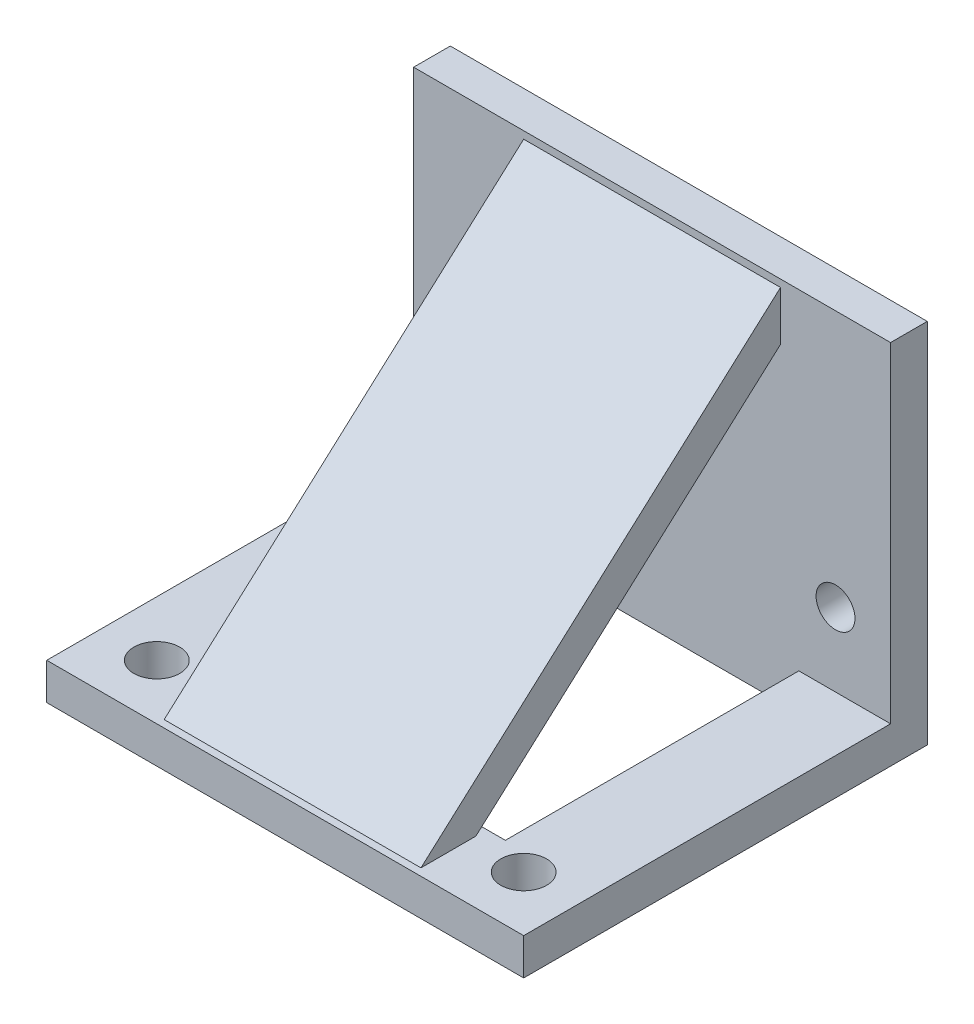
ISO-10303-21;
HEADER;
FILE_DESCRIPTION(('STEP AP214'),'2;1');
FILE_NAME('part.step','',(''),(''),'','','');
FILE_SCHEMA(('AUTOMOTIVE_DESIGN { 1 0 10303 214 1 1 1 1 }'));
ENDSEC;
DATA;
#1=APPLICATION_CONTEXT('core data for automotive mechanical design processes');
#2=APPLICATION_PROTOCOL_DEFINITION('international standard','automotive_design',2000,#1);
#3=PRODUCT_CONTEXT('',#1,'mechanical');
#4=PRODUCT('Part','Part','',(#3));
#5=PRODUCT_RELATED_PRODUCT_CATEGORY('part','',(#4));
#6=PRODUCT_DEFINITION_FORMATION('','',#4);
#7=PRODUCT_DEFINITION_CONTEXT('part definition',#1,'design');
#8=PRODUCT_DEFINITION('design','',#6,#7);
#9=PRODUCT_DEFINITION_SHAPE('','',#8);
#10=(LENGTH_UNIT() NAMED_UNIT(*) SI_UNIT(.MILLI.,.METRE.));
#11=(NAMED_UNIT(*) PLANE_ANGLE_UNIT() SI_UNIT($,.RADIAN.));
#12=(NAMED_UNIT(*) SI_UNIT($,.STERADIAN.) SOLID_ANGLE_UNIT());
#13=UNCERTAINTY_MEASURE_WITH_UNIT(LENGTH_MEASURE(1.E-05),#10,'distance_accuracy_value','');
#14=(GEOMETRIC_REPRESENTATION_CONTEXT(3) GLOBAL_UNCERTAINTY_ASSIGNED_CONTEXT((#13)) GLOBAL_UNIT_ASSIGNED_CONTEXT((#10,
#11,#12)) REPRESENTATION_CONTEXT('',''));
#15=CARTESIAN_POINT('',(0.,0.,0.));
#16=DIRECTION('',(0.,0.,1.));
#17=DIRECTION('',(1.,0.,0.));
#18=AXIS2_PLACEMENT_3D('',#15,#16,#17);
#19=CARTESIAN_POINT('',(0.,0.,5.));
#20=DIRECTION('',(0.,1.,0.));
#21=DIRECTION('',(-1.,0.,0.));
#22=AXIS2_PLACEMENT_3D('',#19,#20,#21);
#23=PLANE('',#22);
#24=DIRECTION('',(0.,0.,-1.));
#25=VECTOR('',#24,1.);
#26=CARTESIAN_POINT('',(-20.,0.,45.));
#27=LINE('',#26,#25);
#28=CARTESIAN_POINT('',(-20.,0.,45.));
#29=VERTEX_POINT('',#28);
#30=CARTESIAN_POINT('',(-20.,0.,5.));
#31=VERTEX_POINT('',#30);
#32=EDGE_CURVE('E149',#29,#31,#27,.T.);
#33=ORIENTED_EDGE('',*,*,#32,.F.);
#34=DIRECTION('',(-1.,0.,0.));
#35=VECTOR('',#34,1.);
#36=CARTESIAN_POINT('',(-20.,0.,45.));
#37=LINE('',#36,#35);
#38=CARTESIAN_POINT('',(20.,0.,45.));
#39=VERTEX_POINT('',#38);
#40=EDGE_CURVE('E363',#39,#29,#37,.T.);
#41=ORIENTED_EDGE('',*,*,#40,.F.);
#42=DIRECTION('',(0.,0.,1.));
#43=VECTOR('',#42,1.);
#44=CARTESIAN_POINT('',(20.,0.,45.));
#45=LINE('',#44,#43);
#46=CARTESIAN_POINT('',(20.,0.,5.));
#47=VERTEX_POINT('',#46);
#48=EDGE_CURVE('E161',#47,#39,#45,.T.);
#49=ORIENTED_EDGE('',*,*,#48,.F.);
#50=DIRECTION('',(1.,0.,0.));
#51=VECTOR('',#50,1.);
#52=CARTESIAN_POINT('',(-20.,0.,5.));
#53=LINE('',#52,#51);
#54=EDGE_CURVE('E57',#31,#47,#53,.T.);
#55=ORIENTED_EDGE('',*,*,#54,.F.);
#56=EDGE_LOOP('',(#33,#41,#49,#55));
#57=FACE_BOUND('',#56,.T.);
#58=CARTESIAN_POINT('',(-25.,0.,47.5));
#59=DIRECTION('',(0.,1.,0.));
#60=DIRECTION('',(-1.,0.,0.));
#61=AXIS2_PLACEMENT_3D('',#58,#59,#60);
#62=CIRCLE('',#61,3.125);
#63=CARTESIAN_POINT('',(-28.125,0.,47.5));
#64=VERTEX_POINT('',#63);
#65=EDGE_CURVE('E177',#64,#64,#62,.T.);
#66=ORIENTED_EDGE('',*,*,#65,.T.);
#67=EDGE_LOOP('',(#66));
#68=FACE_BOUND('',#67,.T.);
#69=CARTESIAN_POINT('',(25.,0.,47.5));
#70=DIRECTION('',(0.,1.,0.));
#71=DIRECTION('',(1.,0.,0.));
#72=AXIS2_PLACEMENT_3D('',#69,#70,#71);
#73=CIRCLE('',#72,3.125);
#74=CARTESIAN_POINT('',(28.125,0.,47.5));
#75=VERTEX_POINT('',#74);
#76=EDGE_CURVE('E181',#75,#75,#73,.T.);
#77=ORIENTED_EDGE('',*,*,#76,.T.);
#78=EDGE_LOOP('',(#77));
#79=FACE_BOUND('',#78,.T.);
#80=DIRECTION('',(1.,0.,0.));
#81=VECTOR('',#80,1.);
#82=CARTESIAN_POINT('',(0.,0.,0.));
#83=LINE('',#82,#81);
#84=CARTESIAN_POINT('',(-32.5,0.,0.));
#85=VERTEX_POINT('',#84);
#86=CARTESIAN_POINT('',(32.5,0.,0.));
#87=VERTEX_POINT('',#86);
#88=EDGE_CURVE('E226',#85,#87,#83,.T.);
#89=ORIENTED_EDGE('',*,*,#88,.T.);
#90=DIRECTION('',(0.,0.,-1.));
#91=VECTOR('',#90,1.);
#92=CARTESIAN_POINT('',(32.5,0.,5.));
#93=LINE('',#92,#91);
#94=CARTESIAN_POINT('',(32.5,0.,55.));
#95=VERTEX_POINT('',#94);
#96=EDGE_CURVE('E50',#95,#87,#93,.T.);
#97=ORIENTED_EDGE('',*,*,#96,.F.);
#98=DIRECTION('',(1.,0.,0.));
#99=VECTOR('',#98,1.);
#100=CARTESIAN_POINT('',(-32.5,0.,55.));
#101=LINE('',#100,#99);
#102=CARTESIAN_POINT('',(-32.5,0.,55.));
#103=VERTEX_POINT('',#102);
#104=EDGE_CURVE('E220',#103,#95,#101,.T.);
#105=ORIENTED_EDGE('',*,*,#104,.F.);
#106=DIRECTION('',(0.,0.,-1.));
#107=VECTOR('',#106,1.);
#108=CARTESIAN_POINT('',(-32.5,0.,5.));
#109=LINE('',#108,#107);
#110=EDGE_CURVE('E238',#103,#85,#109,.T.);
#111=ORIENTED_EDGE('',*,*,#110,.T.);
#112=EDGE_LOOP('',(#89,#97,#105,#111));
#113=FACE_BOUND('',#112,.T.);
#114=ADVANCED_FACE('F43',(#57,#68,#79,#113),#23,.F.);
#115=CARTESIAN_POINT('',(32.5,0.,5.));
#116=DIRECTION('',(-1.,0.,0.));
#117=DIRECTION('',(0.,0.,1.));
#118=AXIS2_PLACEMENT_3D('',#115,#116,#117);
#119=PLANE('',#118);
#120=DIRECTION('',(0.,-1.,0.));
#121=VECTOR('',#120,1.);
#122=CARTESIAN_POINT('',(32.5,50.,5.));
#123=LINE('',#122,#121);
#124=CARTESIAN_POINT('',(32.5,50.,5.));
#125=VERTEX_POINT('',#124);
#126=CARTESIAN_POINT('',(32.5,5.00000000000004,5.));
#127=VERTEX_POINT('',#126);
#128=EDGE_CURVE('E199',#125,#127,#123,.T.);
#129=ORIENTED_EDGE('',*,*,#128,.T.);
#130=DIRECTION('',(0.,0.,1.));
#131=VECTOR('',#130,1.);
#132=CARTESIAN_POINT('',(32.5,5.00000000000004,54.));
#133=LINE('',#132,#131);
#134=CARTESIAN_POINT('',(32.5,5.00000000000004,55.));
#135=VERTEX_POINT('',#134);
#136=EDGE_CURVE('E202',#127,#135,#133,.T.);
#137=ORIENTED_EDGE('',*,*,#136,.T.);
#138=DIRECTION('',(0.,1.,0.));
#139=VECTOR('',#138,1.);
#140=CARTESIAN_POINT('',(32.5,50.,55.));
#141=LINE('',#140,#139);
#142=EDGE_CURVE('E223',#95,#135,#141,.T.);
#143=ORIENTED_EDGE('',*,*,#142,.F.);
#144=ORIENTED_EDGE('',*,*,#96,.T.);
#145=DIRECTION('',(0.,1.,0.));
#146=VECTOR('',#145,1.);
#147=CARTESIAN_POINT('',(32.5,0.,0.));
#148=LINE('',#147,#146);
#149=CARTESIAN_POINT('',(32.5,50.,0.));
#150=VERTEX_POINT('',#149);
#151=EDGE_CURVE('E229',#87,#150,#148,.T.);
#152=ORIENTED_EDGE('',*,*,#151,.T.);
#153=DIRECTION('',(0.,0.,-1.));
#154=VECTOR('',#153,1.);
#155=CARTESIAN_POINT('',(32.5,50.,5.));
#156=LINE('',#155,#154);
#157=EDGE_CURVE('E242',#125,#150,#156,.T.);
#158=ORIENTED_EDGE('',*,*,#157,.F.);
#159=EDGE_LOOP('',(#129,#137,#143,#144,#152,#158));
#160=FACE_BOUND('',#159,.T.);
#161=ADVANCED_FACE('F246',(#160),#119,.F.);
#162=CARTESIAN_POINT('',(0.,50.,5.));
#163=DIRECTION('',(0.,1.,0.));
#164=DIRECTION('',(-1.,0.,0.));
#165=AXIS2_PLACEMENT_3D('',#162,#163,#164);
#166=PLANE('',#165);
#167=DIRECTION('',(-1.,0.,0.));
#168=VECTOR('',#167,1.);
#169=CARTESIAN_POINT('',(32.5,50.,5.));
#170=LINE('',#169,#168);
#171=CARTESIAN_POINT('',(-32.5,50.,5.));
#172=VERTEX_POINT('',#171);
#173=EDGE_CURVE('E205',#125,#172,#170,.T.);
#174=ORIENTED_EDGE('',*,*,#173,.F.);
#175=ORIENTED_EDGE('',*,*,#157,.T.);
#176=DIRECTION('',(1.,0.,0.));
#177=VECTOR('',#176,1.);
#178=CARTESIAN_POINT('',(0.,50.,0.));
#179=LINE('',#178,#177);
#180=CARTESIAN_POINT('',(-32.5,50.,0.));
#181=VERTEX_POINT('',#180);
#182=EDGE_CURVE('E232',#181,#150,#179,.T.);
#183=ORIENTED_EDGE('',*,*,#182,.F.);
#184=DIRECTION('',(0.,0.,-1.));
#185=VECTOR('',#184,1.);
#186=CARTESIAN_POINT('',(-32.5,50.,5.));
#187=LINE('',#186,#185);
#188=EDGE_CURVE('E240',#172,#181,#187,.T.);
#189=ORIENTED_EDGE('',*,*,#188,.F.);
#190=EDGE_LOOP('',(#174,#175,#183,#189));
#191=FACE_BOUND('',#190,.T.);
#192=ADVANCED_FACE('F262',(#191),#166,.T.);
#193=CARTESIAN_POINT('',(-32.5,0.,5.));
#194=DIRECTION('',(-1.,0.,0.));
#195=DIRECTION('',(0.,-1.,0.));
#196=AXIS2_PLACEMENT_3D('',#193,#194,#195);
#197=PLANE('',#196);
#198=DIRECTION('',(0.,0.,1.));
#199=VECTOR('',#198,1.);
#200=CARTESIAN_POINT('',(-32.5,5.,54.));
#201=LINE('',#200,#199);
#202=CARTESIAN_POINT('',(-32.5,5.00000000000004,5.));
#203=VERTEX_POINT('',#202);
#204=CARTESIAN_POINT('',(-32.5,5.,55.));
#205=VERTEX_POINT('',#204);
#206=EDGE_CURVE('E203',#203,#205,#201,.T.);
#207=ORIENTED_EDGE('',*,*,#206,.F.);
#208=DIRECTION('',(0.,-1.,0.));
#209=VECTOR('',#208,1.);
#210=CARTESIAN_POINT('',(-32.5,50.,5.));
#211=LINE('',#210,#209);
#212=EDGE_CURVE('E166',#172,#203,#211,.T.);
#213=ORIENTED_EDGE('',*,*,#212,.F.);
#214=ORIENTED_EDGE('',*,*,#188,.T.);
#215=DIRECTION('',(0.,1.,0.));
#216=VECTOR('',#215,1.);
#217=CARTESIAN_POINT('',(-32.5,0.,0.));
#218=LINE('',#217,#216);
#219=EDGE_CURVE('E235',#85,#181,#218,.T.);
#220=ORIENTED_EDGE('',*,*,#219,.F.);
#221=ORIENTED_EDGE('',*,*,#110,.F.);
#222=DIRECTION('',(0.,-1.,0.));
#223=VECTOR('',#222,1.);
#224=CARTESIAN_POINT('',(-32.5,50.,55.));
#225=LINE('',#224,#223);
#226=EDGE_CURVE('E211',#205,#103,#225,.T.);
#227=ORIENTED_EDGE('',*,*,#226,.F.);
#228=EDGE_LOOP('',(#207,#213,#214,#220,#221,#227));
#229=FACE_BOUND('',#228,.T.);
#230=ADVANCED_FACE('F256',(#229),#197,.T.);
#231=CARTESIAN_POINT('',(0.,0.,0.));
#232=DIRECTION('',(0.,0.,1.));
#233=DIRECTION('',(1.,0.,0.));
#234=AXIS2_PLACEMENT_3D('',#231,#232,#233);
#235=PLANE('',#234);
#236=CARTESIAN_POINT('',(-25.,15.,0.));
#237=DIRECTION('',(0.,0.,1.));
#238=DIRECTION('',(1.,0.,0.));
#239=AXIS2_PLACEMENT_3D('',#236,#237,#238);
#240=CIRCLE('',#239,2.65);
#241=CARTESIAN_POINT('',(-22.35,15.,0.));
#242=VERTEX_POINT('',#241);
#243=EDGE_CURVE('E189',#242,#242,#240,.T.);
#244=ORIENTED_EDGE('',*,*,#243,.T.);
#245=EDGE_LOOP('',(#244));
#246=FACE_BOUND('',#245,.T.);
#247=CARTESIAN_POINT('',(25.,15.,0.));
#248=DIRECTION('',(0.,0.,1.));
#249=DIRECTION('',(-1.,0.,0.));
#250=AXIS2_PLACEMENT_3D('',#247,#248,#249);
#251=CIRCLE('',#250,2.65);
#252=CARTESIAN_POINT('',(22.35,15.,0.));
#253=VERTEX_POINT('',#252);
#254=EDGE_CURVE('E180',#253,#253,#251,.T.);
#255=ORIENTED_EDGE('',*,*,#254,.T.);
#256=EDGE_LOOP('',(#255));
#257=FACE_BOUND('',#256,.T.);
#258=ORIENTED_EDGE('',*,*,#88,.F.);
#259=ORIENTED_EDGE('',*,*,#219,.T.);
#260=ORIENTED_EDGE('',*,*,#182,.T.);
#261=ORIENTED_EDGE('',*,*,#151,.F.);
#262=EDGE_LOOP('',(#258,#259,#260,#261));
#263=FACE_BOUND('',#262,.T.);
#264=ADVANCED_FACE('F254',(#246,#257,#263),#235,.F.);
#265=CARTESIAN_POINT('',(0.,0.,55.));
#266=DIRECTION('',(0.,0.,1.));
#267=DIRECTION('',(1.,0.,0.));
#268=AXIS2_PLACEMENT_3D('',#265,#266,#267);
#269=PLANE('',#268);
#270=DIRECTION('',(-1.,0.,0.));
#271=VECTOR('',#270,1.);
#272=CARTESIAN_POINT('',(32.5,5.00000000000004,55.));
#273=LINE('',#272,#271);
#274=EDGE_CURVE('E208',#135,#205,#273,.T.);
#275=ORIENTED_EDGE('',*,*,#274,.T.);
#276=ORIENTED_EDGE('',*,*,#226,.T.);
#277=ORIENTED_EDGE('',*,*,#104,.T.);
#278=ORIENTED_EDGE('',*,*,#142,.T.);
#279=EDGE_LOOP('',(#275,#276,#277,#278));
#280=FACE_BOUND('',#279,.T.);
#281=ADVANCED_FACE('F267',(#280),#269,.T.);
#282=CARTESIAN_POINT('',(32.5,5.00000000000004,54.));
#283=DIRECTION('',(0.,-1.,0.));
#284=DIRECTION('',(1.,0.,0.));
#285=AXIS2_PLACEMENT_3D('',#282,#283,#284);
#286=PLANE('',#285);
#287=CARTESIAN_POINT('',(25.,5.00000000000003,47.5));
#288=DIRECTION('',(0.,1.,0.));
#289=DIRECTION('',(1.,0.,0.));
#290=AXIS2_PLACEMENT_3D('',#287,#288,#289);
#291=CIRCLE('',#290,3.125);
#292=CARTESIAN_POINT('',(28.125,5.00000000000003,47.5));
#293=VERTEX_POINT('',#292);
#294=EDGE_CURVE('E167',#293,#293,#291,.T.);
#295=ORIENTED_EDGE('',*,*,#294,.F.);
#296=EDGE_LOOP('',(#295));
#297=FACE_BOUND('',#296,.T.);
#298=DIRECTION('',(1.,0.,0.));
#299=VECTOR('',#298,1.);
#300=CARTESIAN_POINT('',(-32.5,5.00000000000004,46.5163746245332));
#301=LINE('',#300,#299);
#302=CARTESIAN_POINT('',(-17.5,5.00000000000004,46.5163746245332));
#303=VERTEX_POINT('',#302);
#304=CARTESIAN_POINT('',(17.5,5.00000000000004,46.5163746245332));
#305=VERTEX_POINT('',#304);
#306=EDGE_CURVE('E305',#303,#305,#301,.T.);
#307=ORIENTED_EDGE('',*,*,#306,.T.);
#308=DIRECTION('',(0.,0.,-1.));
#309=VECTOR('',#308,1.);
#310=CARTESIAN_POINT('',(17.5,5.00000000000004,54.));
#311=LINE('',#310,#309);
#312=CARTESIAN_POINT('',(17.5,5.00000000000004,54.));
#313=VERTEX_POINT('',#312);
#314=EDGE_CURVE('E173',#313,#305,#311,.T.);
#315=ORIENTED_EDGE('',*,*,#314,.F.);
#316=DIRECTION('',(-1.,0.,0.));
#317=VECTOR('',#316,1.);
#318=CARTESIAN_POINT('',(32.5,5.00000000000004,54.));
#319=LINE('',#318,#317);
#320=CARTESIAN_POINT('',(-17.5,5.00000000000004,54.));
#321=VERTEX_POINT('',#320);
#322=EDGE_CURVE('E212',#313,#321,#319,.T.);
#323=ORIENTED_EDGE('',*,*,#322,.T.);
#324=DIRECTION('',(0.,0.,1.));
#325=VECTOR('',#324,1.);
#326=CARTESIAN_POINT('',(-17.5,5.00000000000004,5.));
#327=LINE('',#326,#325);
#328=EDGE_CURVE('E349',#303,#321,#327,.T.);
#329=ORIENTED_EDGE('',*,*,#328,.F.);
#330=EDGE_LOOP('',(#307,#315,#323,#329));
#331=FACE_BOUND('',#330,.T.);
#332=CARTESIAN_POINT('',(-25.,5.,47.5));
#333=DIRECTION('',(0.,1.,0.));
#334=DIRECTION('',(-1.,0.,0.));
#335=AXIS2_PLACEMENT_3D('',#332,#333,#334);
#336=CIRCLE('',#335,3.125);
#337=CARTESIAN_POINT('',(-28.125,5.,47.5));
#338=VERTEX_POINT('',#337);
#339=EDGE_CURVE('E182',#338,#338,#336,.T.);
#340=ORIENTED_EDGE('',*,*,#339,.F.);
#341=EDGE_LOOP('',(#340));
#342=FACE_BOUND('',#341,.T.);
#343=DIRECTION('',(1.,0.,0.));
#344=VECTOR('',#343,1.);
#345=CARTESIAN_POINT('',(-20.,5.00000000000001,45.));
#346=LINE('',#345,#344);
#347=CARTESIAN_POINT('',(-20.,5.00000000000002,45.));
#348=VERTEX_POINT('',#347);
#349=CARTESIAN_POINT('',(20.,5.00000000000003,45.));
#350=VERTEX_POINT('',#349);
#351=EDGE_CURVE('E160',#348,#350,#346,.T.);
#352=ORIENTED_EDGE('',*,*,#351,.F.);
#353=DIRECTION('',(0.,0.,1.));
#354=VECTOR('',#353,1.);
#355=CARTESIAN_POINT('',(-20.,5.00000000000001,45.));
#356=LINE('',#355,#354);
#357=CARTESIAN_POINT('',(-20.,5.00000000000004,5.));
#358=VERTEX_POINT('',#357);
#359=EDGE_CURVE('E146',#358,#348,#356,.T.);
#360=ORIENTED_EDGE('',*,*,#359,.F.);
#361=DIRECTION('',(1.,0.,0.));
#362=VECTOR('',#361,1.);
#363=CARTESIAN_POINT('',(17.5,5.00000000000004,5.));
#364=LINE('',#363,#362);
#365=EDGE_CURVE('E157',#203,#358,#364,.T.);
#366=ORIENTED_EDGE('',*,*,#365,.F.);
#367=ORIENTED_EDGE('',*,*,#206,.T.);
#368=ORIENTED_EDGE('',*,*,#274,.F.);
#369=ORIENTED_EDGE('',*,*,#136,.F.);
#370=CARTESIAN_POINT('',(20.,5.00000000000004,5.));
#371=VERTEX_POINT('',#370);
#372=EDGE_CURVE('E168',#371,#127,#364,.T.);
#373=ORIENTED_EDGE('',*,*,#372,.F.);
#374=DIRECTION('',(0.,0.,-1.));
#375=VECTOR('',#374,1.);
#376=CARTESIAN_POINT('',(20.,5.00000000000003,45.));
#377=LINE('',#376,#375);
#378=EDGE_CURVE('E64',#350,#371,#377,.T.);
#379=ORIENTED_EDGE('',*,*,#378,.F.);
#380=EDGE_LOOP('',(#352,#360,#366,#367,#368,#369,#373,#379));
#381=FACE_BOUND('',#380,.T.);
#382=ADVANCED_FACE('F156',(#297,#331,#342,#381),#286,.F.);
#383=CARTESIAN_POINT('',(32.5,49.,5.));
#384=DIRECTION('',(0.,-0.744048711529002,-0.66812537361788));
#385=DIRECTION('',(0.,0.66812537361788,-0.744048711529002));
#386=AXIS2_PLACEMENT_3D('',#383,#384,#385);
#387=PLANE('',#386);
#388=DIRECTION('',(-1.,0.,0.));
#389=VECTOR('',#388,1.);
#390=CARTESIAN_POINT('',(32.5,49.,5.));
#391=LINE('',#390,#389);
#392=CARTESIAN_POINT('',(17.5,49.,5.));
#393=VERTEX_POINT('',#392);
#394=CARTESIAN_POINT('',(-17.5,49.,5.));
#395=VERTEX_POINT('',#394);
#396=EDGE_CURVE('E215',#393,#395,#391,.T.);
#397=ORIENTED_EDGE('',*,*,#396,.T.);
#398=DIRECTION('',(0.,0.66812537361788,-0.744048711529002));
#399=VECTOR('',#398,1.);
#400=CARTESIAN_POINT('',(-17.5,27.1268157712705,29.3587733456306));
#401=LINE('',#400,#399);
#402=EDGE_CURVE('E347',#321,#395,#401,.T.);
#403=ORIENTED_EDGE('',*,*,#402,.F.);
#404=ORIENTED_EDGE('',*,*,#322,.F.);
#405=DIRECTION('',(0.,-0.66812537361788,0.744048711529002));
#406=VECTOR('',#405,1.);
#407=CARTESIAN_POINT('',(17.5,49.,5.));
#408=LINE('',#407,#406);
#409=EDGE_CURVE('E353',#393,#313,#408,.T.);
#410=ORIENTED_EDGE('',*,*,#409,.F.);
#411=EDGE_LOOP('',(#397,#403,#404,#410));
#412=FACE_BOUND('',#411,.T.);
#413=ADVANCED_FACE('F275',(#412),#387,.F.);
#414=CARTESIAN_POINT('',(32.5,50.,5.));
#415=DIRECTION('',(0.,0.,-1.));
#416=DIRECTION('',(-1.,0.,0.));
#417=AXIS2_PLACEMENT_3D('',#414,#415,#416);
#418=PLANE('',#417);
#419=DIRECTION('',(1.,0.,0.));
#420=VECTOR('',#419,1.);
#421=CARTESIAN_POINT('',(-32.5,42.2800098669278,5.));
#422=LINE('',#421,#420);
#423=CARTESIAN_POINT('',(-17.5,42.2800098669278,5.));
#424=VERTEX_POINT('',#423);
#425=CARTESIAN_POINT('',(17.5,42.2800098669278,5.));
#426=VERTEX_POINT('',#425);
#427=EDGE_CURVE('E337',#424,#426,#422,.T.);
#428=ORIENTED_EDGE('',*,*,#427,.F.);
#429=DIRECTION('',(0.,-1.,0.));
#430=VECTOR('',#429,1.);
#431=CARTESIAN_POINT('',(-17.5,0.,5.));
#432=LINE('',#431,#430);
#433=EDGE_CURVE('E194',#395,#424,#432,.T.);
#434=ORIENTED_EDGE('',*,*,#433,.F.);
#435=ORIENTED_EDGE('',*,*,#396,.F.);
#436=DIRECTION('',(0.,1.,0.));
#437=VECTOR('',#436,1.);
#438=CARTESIAN_POINT('',(17.5,5.00000000000004,5.));
#439=LINE('',#438,#437);
#440=EDGE_CURVE('E184',#426,#393,#439,.T.);
#441=ORIENTED_EDGE('',*,*,#440,.F.);
#442=EDGE_LOOP('',(#428,#434,#435,#441));
#443=FACE_BOUND('',#442,.T.);
#444=ORIENTED_EDGE('',*,*,#212,.T.);
#445=ORIENTED_EDGE('',*,*,#365,.T.);
#446=DIRECTION('',(0.,-1.,0.));
#447=VECTOR('',#446,1.);
#448=CARTESIAN_POINT('',(-20.,50.001,5.));
#449=LINE('',#448,#447);
#450=EDGE_CURVE('E143',#358,#31,#449,.T.);
#451=ORIENTED_EDGE('',*,*,#450,.T.);
#452=ORIENTED_EDGE('',*,*,#54,.T.);
#453=DIRECTION('',(0.,-1.,0.));
#454=VECTOR('',#453,1.);
#455=CARTESIAN_POINT('',(20.,50.001,5.));
#456=LINE('',#455,#454);
#457=EDGE_CURVE('E151',#371,#47,#456,.T.);
#458=ORIENTED_EDGE('',*,*,#457,.F.);
#459=ORIENTED_EDGE('',*,*,#372,.T.);
#460=ORIENTED_EDGE('',*,*,#128,.F.);
#461=ORIENTED_EDGE('',*,*,#173,.T.);
#462=EDGE_LOOP('',(#444,#445,#451,#452,#458,#459,#460,#461));
#463=FACE_BOUND('',#462,.T.);
#464=CARTESIAN_POINT('',(25.,15.,5.));
#465=DIRECTION('',(0.,0.,1.));
#466=DIRECTION('',(-1.,0.,0.));
#467=AXIS2_PLACEMENT_3D('',#464,#465,#466);
#468=CIRCLE('',#467,2.65);
#469=CARTESIAN_POINT('',(22.35,15.,5.));
#470=VERTEX_POINT('',#469);
#471=EDGE_CURVE('E171',#470,#470,#468,.T.);
#472=ORIENTED_EDGE('',*,*,#471,.F.);
#473=EDGE_LOOP('',(#472));
#474=FACE_BOUND('',#473,.T.);
#475=CARTESIAN_POINT('',(-25.,15.,5.));
#476=DIRECTION('',(0.,0.,1.));
#477=DIRECTION('',(1.,0.,0.));
#478=AXIS2_PLACEMENT_3D('',#475,#476,#477);
#479=CIRCLE('',#478,2.65);
#480=CARTESIAN_POINT('',(-22.35,15.,5.));
#481=VERTEX_POINT('',#480);
#482=EDGE_CURVE('E185',#481,#481,#479,.T.);
#483=ORIENTED_EDGE('',*,*,#482,.F.);
#484=EDGE_LOOP('',(#483));
#485=FACE_BOUND('',#484,.T.);
#486=ADVANCED_FACE('F163',(#443,#463,#474,#485),#418,.F.);
#487=CARTESIAN_POINT('',(25.,15.,0.));
#488=DIRECTION('',(0.,0.,1.));
#489=DIRECTION('',(1.,0.,0.));
#490=AXIS2_PLACEMENT_3D('',#487,#488,#489);
#491=CYLINDRICAL_SURFACE('',#490,2.65);
#492=ORIENTED_EDGE('',*,*,#254,.F.);
#493=EDGE_LOOP('',(#492));
#494=FACE_BOUND('',#493,.T.);
#495=ORIENTED_EDGE('',*,*,#471,.T.);
#496=EDGE_LOOP('',(#495));
#497=FACE_BOUND('',#496,.T.);
#498=ADVANCED_FACE('F323',(#494,#497),#491,.F.);
#499=CARTESIAN_POINT('',(-25.,15.,0.));
#500=DIRECTION('',(0.,0.,1.));
#501=DIRECTION('',(1.,0.,0.));
#502=AXIS2_PLACEMENT_3D('',#499,#500,#501);
#503=CYLINDRICAL_SURFACE('',#502,2.65);
#504=ORIENTED_EDGE('',*,*,#243,.F.);
#505=EDGE_LOOP('',(#504));
#506=FACE_BOUND('',#505,.T.);
#507=ORIENTED_EDGE('',*,*,#482,.T.);
#508=EDGE_LOOP('',(#507));
#509=FACE_BOUND('',#508,.T.);
#510=ADVANCED_FACE('F297',(#506,#509),#503,.F.);
#511=CARTESIAN_POINT('',(25.,0.,47.5));
#512=DIRECTION('',(0.,1.,0.));
#513=DIRECTION('',(-1.,0.,0.));
#514=AXIS2_PLACEMENT_3D('',#511,#512,#513);
#515=CYLINDRICAL_SURFACE('',#514,3.125);
#516=ORIENTED_EDGE('',*,*,#76,.F.);
#517=EDGE_LOOP('',(#516));
#518=FACE_BOUND('',#517,.T.);
#519=ORIENTED_EDGE('',*,*,#294,.T.);
#520=EDGE_LOOP('',(#519));
#521=FACE_BOUND('',#520,.T.);
#522=ADVANCED_FACE('F293',(#518,#521),#515,.F.);
#523=CARTESIAN_POINT('',(-25.,0.,47.5));
#524=DIRECTION('',(0.,1.,0.));
#525=DIRECTION('',(-1.,0.,0.));
#526=AXIS2_PLACEMENT_3D('',#523,#524,#525);
#527=CYLINDRICAL_SURFACE('',#526,3.125);
#528=ORIENTED_EDGE('',*,*,#65,.F.);
#529=EDGE_LOOP('',(#528));
#530=FACE_BOUND('',#529,.T.);
#531=ORIENTED_EDGE('',*,*,#339,.T.);
#532=EDGE_LOOP('',(#531));
#533=FACE_BOUND('',#532,.T.);
#534=ADVANCED_FACE('F296',(#530,#533),#527,.F.);
#535=CARTESIAN_POINT('',(17.5,0.,0.));
#536=DIRECTION('',(-1.,0.,0.));
#537=DIRECTION('',(0.,0.,1.));
#538=AXIS2_PLACEMENT_3D('',#535,#536,#537);
#539=PLANE('',#538);
#540=ORIENTED_EDGE('',*,*,#314,.T.);
#541=DIRECTION('',(0.,0.66812537361788,-0.744048711529002));
#542=VECTOR('',#541,1.);
#543=CARTESIAN_POINT('',(17.5,25.8921613305266,23.2501040519014));
#544=LINE('',#543,#542);
#545=EDGE_CURVE('E355',#305,#426,#544,.T.);
#546=ORIENTED_EDGE('',*,*,#545,.T.);
#547=ORIENTED_EDGE('',*,*,#440,.T.);
#548=ORIENTED_EDGE('',*,*,#409,.T.);
#549=EDGE_LOOP('',(#540,#546,#547,#548));
#550=FACE_BOUND('',#549,.T.);
#551=ADVANCED_FACE('F310',(#550),#539,.F.);
#552=CARTESIAN_POINT('',(-17.5,0.,0.));
#553=DIRECTION('',(1.,0.,0.));
#554=DIRECTION('',(0.,1.,0.));
#555=AXIS2_PLACEMENT_3D('',#552,#553,#554);
#556=PLANE('',#555);
#557=ORIENTED_EDGE('',*,*,#433,.T.);
#558=DIRECTION('',(0.,-0.66812537361788,0.744048711529002));
#559=VECTOR('',#558,1.);
#560=CARTESIAN_POINT('',(-17.5,25.8921613305266,23.2501040519014));
#561=LINE('',#560,#559);
#562=EDGE_CURVE('E11',#424,#303,#561,.T.);
#563=ORIENTED_EDGE('',*,*,#562,.T.);
#564=ORIENTED_EDGE('',*,*,#328,.T.);
#565=ORIENTED_EDGE('',*,*,#402,.T.);
#566=EDGE_LOOP('',(#557,#563,#564,#565));
#567=FACE_BOUND('',#566,.T.);
#568=ADVANCED_FACE('F316',(#567),#556,.F.);
#569=CARTESIAN_POINT('',(-32.5,25.8921613305266,23.2501040519014));
#570=DIRECTION('',(0.,0.744048711529002,0.66812537361788));
#571=DIRECTION('',(0.,-0.66812537361788,0.744048711529002));
#572=AXIS2_PLACEMENT_3D('',#569,#570,#571);
#573=PLANE('',#572);
#574=ORIENTED_EDGE('',*,*,#306,.F.);
#575=ORIENTED_EDGE('',*,*,#562,.F.);
#576=ORIENTED_EDGE('',*,*,#427,.T.);
#577=ORIENTED_EDGE('',*,*,#545,.F.);
#578=EDGE_LOOP('',(#574,#575,#576,#577));
#579=FACE_BOUND('',#578,.T.);
#580=ADVANCED_FACE('F383',(#579),#573,.F.);
#581=CARTESIAN_POINT('',(-20.,50.001,45.));
#582=DIRECTION('',(0.,0.,1.));
#583=DIRECTION('',(1.,0.,0.));
#584=AXIS2_PLACEMENT_3D('',#581,#582,#583);
#585=PLANE('',#584);
#586=ORIENTED_EDGE('',*,*,#351,.T.);
#587=DIRECTION('',(0.,-1.,0.));
#588=VECTOR('',#587,1.);
#589=CARTESIAN_POINT('',(20.,50.001,45.));
#590=LINE('',#589,#588);
#591=EDGE_CURVE('E343',#350,#39,#590,.T.);
#592=ORIENTED_EDGE('',*,*,#591,.T.);
#593=ORIENTED_EDGE('',*,*,#40,.T.);
#594=DIRECTION('',(0.,-1.,0.));
#595=VECTOR('',#594,1.);
#596=CARTESIAN_POINT('',(-20.,50.001,45.));
#597=LINE('',#596,#595);
#598=EDGE_CURVE('E152',#348,#29,#597,.T.);
#599=ORIENTED_EDGE('',*,*,#598,.F.);
#600=EDGE_LOOP('',(#586,#592,#593,#599));
#601=FACE_BOUND('',#600,.T.);
#602=ADVANCED_FACE('F372',(#601),#585,.F.);
#603=CARTESIAN_POINT('',(-20.,50.001,45.));
#604=DIRECTION('',(-1.,0.,0.));
#605=DIRECTION('',(0.,-1.,0.));
#606=AXIS2_PLACEMENT_3D('',#603,#604,#605);
#607=PLANE('',#606);
#608=ORIENTED_EDGE('',*,*,#359,.T.);
#609=ORIENTED_EDGE('',*,*,#598,.T.);
#610=ORIENTED_EDGE('',*,*,#32,.T.);
#611=ORIENTED_EDGE('',*,*,#450,.F.);
#612=EDGE_LOOP('',(#608,#609,#610,#611));
#613=FACE_BOUND('',#612,.T.);
#614=ADVANCED_FACE('F145',(#613),#607,.F.);
#615=CARTESIAN_POINT('',(20.,50.001,45.));
#616=DIRECTION('',(1.,0.,0.));
#617=DIRECTION('',(0.,1.,0.));
#618=AXIS2_PLACEMENT_3D('',#615,#616,#617);
#619=PLANE('',#618);
#620=ORIENTED_EDGE('',*,*,#378,.T.);
#621=ORIENTED_EDGE('',*,*,#457,.T.);
#622=ORIENTED_EDGE('',*,*,#48,.T.);
#623=ORIENTED_EDGE('',*,*,#591,.F.);
#624=EDGE_LOOP('',(#620,#621,#622,#623));
#625=FACE_BOUND('',#624,.T.);
#626=ADVANCED_FACE('F374',(#625),#619,.F.);
#627=CLOSED_SHELL('',(#114,#161,#192,#230,#264,#281,#382,#413,#486,#498,#510,#522,#534,#551,
#568,#580,#602,#614,#626));
#628=MANIFOLD_SOLID_BREP('B2',#627);
#629=ADVANCED_BREP_SHAPE_REPRESENTATION('',(#18,#628),#14);
#630=SHAPE_DEFINITION_REPRESENTATION(#9,#629);
ENDSEC;
END-ISO-10303-21;
